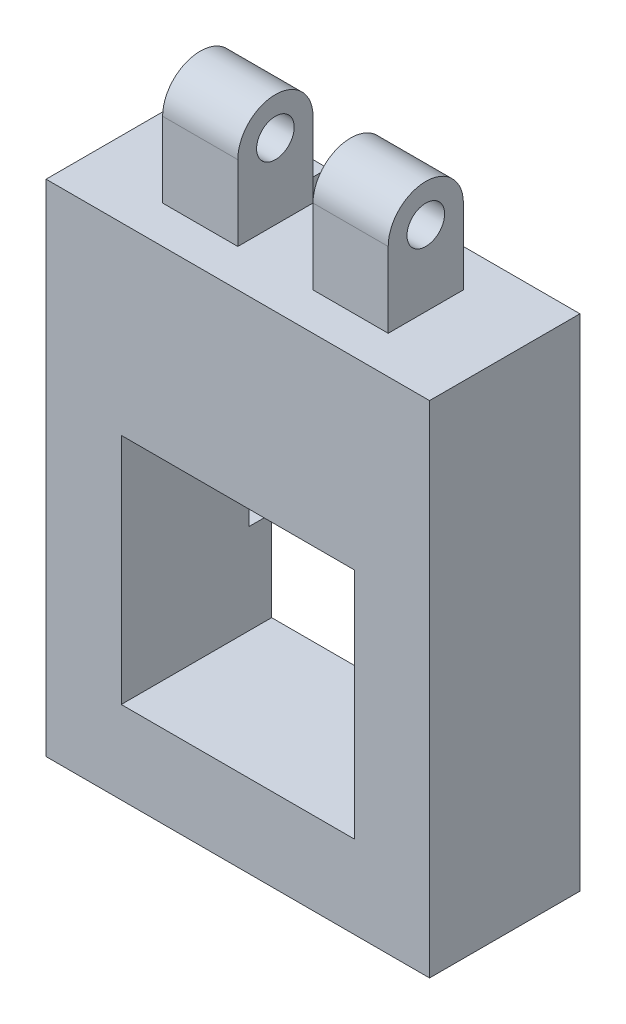
ISO-10303-21;
HEADER;
FILE_DESCRIPTION(('STEP AP214'),'2;1');
FILE_NAME('part.step','',(''),(''),'','','');
FILE_SCHEMA(('AUTOMOTIVE_DESIGN { 1 0 10303 214 1 1 1 1 }'));
ENDSEC;
DATA;
#1=APPLICATION_CONTEXT('core data for automotive mechanical design processes');
#2=APPLICATION_PROTOCOL_DEFINITION('international standard','automotive_design',2000,#1);
#3=PRODUCT_CONTEXT('',#1,'mechanical');
#4=PRODUCT('Part','Part','',(#3));
#5=PRODUCT_RELATED_PRODUCT_CATEGORY('part','',(#4));
#6=PRODUCT_DEFINITION_FORMATION('','',#4);
#7=PRODUCT_DEFINITION_CONTEXT('part definition',#1,'design');
#8=PRODUCT_DEFINITION('design','',#6,#7);
#9=PRODUCT_DEFINITION_SHAPE('','',#8);
#10=(LENGTH_UNIT() NAMED_UNIT(*) SI_UNIT(.MILLI.,.METRE.));
#11=(NAMED_UNIT(*) PLANE_ANGLE_UNIT() SI_UNIT($,.RADIAN.));
#12=(NAMED_UNIT(*) SI_UNIT($,.STERADIAN.) SOLID_ANGLE_UNIT());
#13=UNCERTAINTY_MEASURE_WITH_UNIT(LENGTH_MEASURE(1.E-05),#10,'distance_accuracy_value','');
#14=(GEOMETRIC_REPRESENTATION_CONTEXT(3) GLOBAL_UNCERTAINTY_ASSIGNED_CONTEXT((#13)) GLOBAL_UNIT_ASSIGNED_CONTEXT((#10,
#11,#12)) REPRESENTATION_CONTEXT('',''));
#15=CARTESIAN_POINT('',(0.,0.,0.));
#16=DIRECTION('',(0.,0.,1.));
#17=DIRECTION('',(1.,0.,0.));
#18=AXIS2_PLACEMENT_3D('',#15,#16,#17);
#19=CARTESIAN_POINT('',(-51.4685029579254,477.398568848088,14.9557076845566));
#20=DIRECTION('',(0.,-1.,0.));
#21=DIRECTION('',(0.,0.,-1.));
#22=AXIS2_PLACEMENT_3D('',#19,#20,#21);
#23=PLANE('',#22);
#24=DIRECTION('',(1.,0.,0.));
#25=VECTOR('',#24,1.);
#26=CARTESIAN_POINT('',(-6.46850295793168,477.398568848088,9.95570768455656));
#27=LINE('',#26,#25);
#28=CARTESIAN_POINT('',(3.53149704208093,477.398568848088,9.95570768455656));
#29=VERTEX_POINT('',#28);
#30=CARTESIAN_POINT('',(13.5314970420809,477.398568848088,9.95570768455656));
#31=VERTEX_POINT('',#30);
#32=EDGE_CURVE('E480',#29,#31,#27,.T.);
#33=ORIENTED_EDGE('',*,*,#32,.F.);
#34=DIRECTION('',(-1.26114396703514E-12,0.,-1.));
#35=VECTOR('',#34,1.);
#36=CARTESIAN_POINT('',(3.53149704206832,477.398568848088,-0.0442923154434357));
#37=LINE('',#36,#35);
#38=CARTESIAN_POINT('',(3.53149704206832,477.398568848088,-0.0442923154434357));
#39=VERTEX_POINT('',#38);
#40=EDGE_CURVE('E440',#29,#39,#37,.T.);
#41=ORIENTED_EDGE('',*,*,#40,.T.);
#42=DIRECTION('',(-1.,0.,0.));
#43=VECTOR('',#42,1.);
#44=CARTESIAN_POINT('',(-6.46850295793168,477.398568848088,-0.0442923154434357));
#45=LINE('',#44,#43);
#46=CARTESIAN_POINT('',(13.5314970420809,477.398568848088,-0.0442923154434366));
#47=VERTEX_POINT('',#46);
#48=EDGE_CURVE('E486',#47,#39,#45,.T.);
#49=ORIENTED_EDGE('',*,*,#48,.F.);
#50=DIRECTION('',(0.,0.,-1.));
#51=VECTOR('',#50,1.);
#52=CARTESIAN_POINT('',(13.5314970420809,477.398568848088,9.95570768455656));
#53=LINE('',#52,#51);
#54=EDGE_CURVE('E449',#31,#47,#53,.T.);
#55=ORIENTED_EDGE('',*,*,#54,.F.);
#56=EDGE_LOOP('',(#33,#41,#49,#55));
#57=FACE_BOUND('',#56,.T.);
#58=DIRECTION('',(0.,0.,1.));
#59=VECTOR('',#58,1.);
#60=CARTESIAN_POINT('',(-6.46850295793168,477.398568848088,-0.0442923154434357));
#61=LINE('',#60,#59);
#62=CARTESIAN_POINT('',(-6.46850295793168,477.398568848088,-0.0442923154434357));
#63=VERTEX_POINT('',#62);
#64=CARTESIAN_POINT('',(-6.46850295793168,477.398568848088,9.95570768455656));
#65=VERTEX_POINT('',#64);
#66=EDGE_CURVE('E436',#63,#65,#61,.T.);
#67=ORIENTED_EDGE('',*,*,#66,.T.);
#68=CARTESIAN_POINT('',(-16.4685029579317,477.398568848088,9.95570768455656));
#69=VERTEX_POINT('',#68);
#70=EDGE_CURVE('E481',#69,#65,#27,.T.);
#71=ORIENTED_EDGE('',*,*,#70,.F.);
#72=DIRECTION('',(0.,0.,1.));
#73=VECTOR('',#72,1.);
#74=CARTESIAN_POINT('',(-16.4685029579317,477.398568848088,9.95570768455656));
#75=LINE('',#74,#73);
#76=CARTESIAN_POINT('',(-16.4685029579317,477.398568848088,-0.0442923154434357));
#77=VERTEX_POINT('',#76);
#78=EDGE_CURVE('E470',#77,#69,#75,.T.);
#79=ORIENTED_EDGE('',*,*,#78,.F.);
#80=EDGE_CURVE('E485',#63,#77,#45,.T.);
#81=ORIENTED_EDGE('',*,*,#80,.F.);
#82=EDGE_LOOP('',(#67,#71,#79,#81));
#83=FACE_BOUND('',#82,.T.);
#84=DIRECTION('',(-1.,0.,0.));
#85=VECTOR('',#84,1.);
#86=CARTESIAN_POINT('',(-51.4685029579254,477.398568848088,-5.04429231544344));
#87=LINE('',#86,#85);
#88=CARTESIAN_POINT('',(-9.46850295792537,477.398568848088,-5.04429231544344));
#89=VERTEX_POINT('',#88);
#90=CARTESIAN_POINT('',(-26.9685029579254,477.398568848088,-5.04429231544344));
#91=VERTEX_POINT('',#90);
#92=EDGE_CURVE('E490',#89,#91,#87,.T.);
#93=ORIENTED_EDGE('',*,*,#92,.T.);
#94=DIRECTION('',(0.,0.,1.));
#95=VECTOR('',#94,1.);
#96=CARTESIAN_POINT('',(-26.9685029579254,477.398568848088,14.9557076845566));
#97=LINE('',#96,#95);
#98=CARTESIAN_POINT('',(-26.9685029579254,477.398568848088,14.9557076845566));
#99=VERTEX_POINT('',#98);
#100=EDGE_CURVE('E335',#91,#99,#97,.T.);
#101=ORIENTED_EDGE('',*,*,#100,.T.);
#102=DIRECTION('',(-1.,0.,0.));
#103=VECTOR('',#102,1.);
#104=CARTESIAN_POINT('',(-51.4685029579254,477.398568848088,14.9557076845566));
#105=LINE('',#104,#103);
#106=CARTESIAN_POINT('',(24.0314970420746,477.398568848088,14.9557076845566));
#107=VERTEX_POINT('',#106);
#108=EDGE_CURVE('E491',#107,#99,#105,.T.);
#109=ORIENTED_EDGE('',*,*,#108,.F.);
#110=DIRECTION('',(0.,0.,1.));
#111=VECTOR('',#110,1.);
#112=CARTESIAN_POINT('',(24.0314970420746,477.398568848088,14.9557076845566));
#113=LINE('',#112,#111);
#114=CARTESIAN_POINT('',(24.0314970420746,477.398568848088,-5.04429231544344));
#115=VERTEX_POINT('',#114);
#116=EDGE_CURVE('E330',#115,#107,#113,.T.);
#117=ORIENTED_EDGE('',*,*,#116,.F.);
#118=CARTESIAN_POINT('',(6.53149704207463,477.398568848088,-5.04429231544344));
#119=VERTEX_POINT('',#118);
#120=EDGE_CURVE('E496',#115,#119,#87,.T.);
#121=ORIENTED_EDGE('',*,*,#120,.T.);
#122=DIRECTION('',(0.,0.,-1.));
#123=VECTOR('',#122,1.);
#124=CARTESIAN_POINT('',(6.53149704207463,477.398568848088,-1.04429231544344));
#125=LINE('',#124,#123);
#126=CARTESIAN_POINT('',(6.53149704207463,477.398568848088,-1.04429231544344));
#127=VERTEX_POINT('',#126);
#128=EDGE_CURVE('E367',#127,#119,#125,.T.);
#129=ORIENTED_EDGE('',*,*,#128,.F.);
#130=DIRECTION('',(1.,0.,0.));
#131=VECTOR('',#130,1.);
#132=CARTESIAN_POINT('',(1.46850295792533,477.398568848088,-1.04429231544344));
#133=LINE('',#132,#131);
#134=CARTESIAN_POINT('',(-9.46850295792537,477.398568848088,-1.04429231544344));
#135=VERTEX_POINT('',#134);
#136=EDGE_CURVE('E349',#135,#127,#133,.T.);
#137=ORIENTED_EDGE('',*,*,#136,.F.);
#138=DIRECTION('',(0.,0.,-1.));
#139=VECTOR('',#138,1.);
#140=CARTESIAN_POINT('',(-9.46850295792537,477.398568848088,-1.04429231544344));
#141=LINE('',#140,#139);
#142=EDGE_CURVE('E371',#135,#89,#141,.T.);
#143=ORIENTED_EDGE('',*,*,#142,.T.);
#144=EDGE_LOOP('',(#93,#101,#109,#117,#121,#129,#137,#143));
#145=FACE_BOUND('',#144,.T.);
#146=ADVANCED_FACE('F64',(#57,#83,#145),#23,.F.);
#147=CARTESIAN_POINT('',(1.46850295792533,-437.877293220878,-5.04429231544344));
#148=DIRECTION('',(0.,0.,1.));
#149=DIRECTION('',(1.,0.,0.));
#150=AXIS2_PLACEMENT_3D('',#147,#148,#149);
#151=PLANE('',#150);
#152=DIRECTION('',(0.,1.,0.));
#153=VECTOR('',#152,1.);
#154=CARTESIAN_POINT('',(14.0314970420747,-437.877293220878,-5.04429231544344));
#155=LINE('',#154,#153);
#156=CARTESIAN_POINT('',(14.0314970420746,421.898568848089,-5.04429231544344));
#157=VERTEX_POINT('',#156);
#158=CARTESIAN_POINT('',(14.0314970420746,433.898568848089,-5.04429231544344));
#159=VERTEX_POINT('',#158);
#160=EDGE_CURVE('E509',#157,#159,#155,.T.);
#161=ORIENTED_EDGE('',*,*,#160,.T.);
#162=DIRECTION('',(-1.,0.,0.));
#163=VECTOR('',#162,1.);
#164=CARTESIAN_POINT('',(-23.4685029579254,433.898568848089,-5.04429231544344));
#165=LINE('',#164,#163);
#166=CARTESIAN_POINT('',(20.5314970420746,433.898568848089,-5.04429231544344));
#167=VERTEX_POINT('',#166);
#168=EDGE_CURVE('E275',#167,#159,#165,.T.);
#169=ORIENTED_EDGE('',*,*,#168,.F.);
#170=DIRECTION('',(0.,-1.,0.));
#171=VECTOR('',#170,1.);
#172=CARTESIAN_POINT('',(20.5314970420746,433.898568848089,-5.04429231544344));
#173=LINE('',#172,#171);
#174=CARTESIAN_POINT('',(20.5314970420746,440.898568848089,-5.04429231544344));
#175=VERTEX_POINT('',#174);
#176=EDGE_CURVE('E292',#175,#167,#173,.T.);
#177=ORIENTED_EDGE('',*,*,#176,.F.);
#178=DIRECTION('',(1.,0.,0.));
#179=VECTOR('',#178,1.);
#180=CARTESIAN_POINT('',(-23.4685029579254,440.898568848089,-5.04429231544344));
#181=LINE('',#180,#179);
#182=CARTESIAN_POINT('',(14.0314970420746,440.898568848089,-5.04429231544344));
#183=VERTEX_POINT('',#182);
#184=EDGE_CURVE('E288',#183,#175,#181,.T.);
#185=ORIENTED_EDGE('',*,*,#184,.F.);
#186=CARTESIAN_POINT('',(14.0314970420746,452.898568848089,-5.04429231544344));
#187=VERTEX_POINT('',#186);
#188=EDGE_CURVE('E508',#183,#187,#155,.T.);
#189=ORIENTED_EDGE('',*,*,#188,.T.);
#190=DIRECTION('',(-1.,0.,0.));
#191=VECTOR('',#190,1.);
#192=CARTESIAN_POINT('',(1.46850295792533,452.898568848089,-5.04429231544344));
#193=LINE('',#192,#191);
#194=CARTESIAN_POINT('',(6.53149704207463,452.898568848089,-5.04429231544344));
#195=VERTEX_POINT('',#194);
#196=EDGE_CURVE('E514',#187,#195,#193,.T.);
#197=ORIENTED_EDGE('',*,*,#196,.T.);
#198=DIRECTION('',(0.,1.,0.));
#199=VECTOR('',#198,1.);
#200=CARTESIAN_POINT('',(6.5314970420746,-437.877293220878,-5.04429231544344));
#201=LINE('',#200,#199);
#202=EDGE_CURVE('E345',#195,#119,#201,.T.);
#203=ORIENTED_EDGE('',*,*,#202,.T.);
#204=ORIENTED_EDGE('',*,*,#120,.F.);
#205=DIRECTION('',(0.,-1.,0.));
#206=VECTOR('',#205,1.);
#207=CARTESIAN_POINT('',(24.0314970420746,0.,-5.04429231544344));
#208=LINE('',#207,#206);
#209=CARTESIAN_POINT('',(24.0314970420746,410.898568848089,-5.04429231544344));
#210=VERTEX_POINT('',#209);
#211=EDGE_CURVE('E322',#115,#210,#208,.T.);
#212=ORIENTED_EDGE('',*,*,#211,.T.);
#213=DIRECTION('',(1.,0.,0.));
#214=VECTOR('',#213,1.);
#215=CARTESIAN_POINT('',(0.,410.898568848089,-5.04429231544344));
#216=LINE('',#215,#214);
#217=CARTESIAN_POINT('',(-26.9685029579254,410.898568848089,-5.04429231544344));
#218=VERTEX_POINT('',#217);
#219=EDGE_CURVE('E318',#218,#210,#216,.T.);
#220=ORIENTED_EDGE('',*,*,#219,.F.);
#221=DIRECTION('',(0.,-1.,0.));
#222=VECTOR('',#221,1.);
#223=CARTESIAN_POINT('',(-26.9685029579254,0.,-5.04429231544344));
#224=LINE('',#223,#222);
#225=EDGE_CURVE('E314',#91,#218,#224,.T.);
#226=ORIENTED_EDGE('',*,*,#225,.F.);
#227=ORIENTED_EDGE('',*,*,#92,.F.);
#228=DIRECTION('',(0.,1.,0.));
#229=VECTOR('',#228,1.);
#230=CARTESIAN_POINT('',(-9.46850295792537,-437.877293220878,-5.04429231544344));
#231=LINE('',#230,#229);
#232=CARTESIAN_POINT('',(-9.46850295792537,452.898568848089,-5.04429231544344));
#233=VERTEX_POINT('',#232);
#234=EDGE_CURVE('E339',#233,#89,#231,.T.);
#235=ORIENTED_EDGE('',*,*,#234,.F.);
#236=CARTESIAN_POINT('',(-16.9685029579254,452.898568848089,-5.04429231544344));
#237=VERTEX_POINT('',#236);
#238=EDGE_CURVE('E513',#233,#237,#193,.T.);
#239=ORIENTED_EDGE('',*,*,#238,.T.);
#240=DIRECTION('',(0.,-1.,0.));
#241=VECTOR('',#240,1.);
#242=CARTESIAN_POINT('',(-16.9685029579254,-437.877293220878,-5.04429231544344));
#243=LINE('',#242,#241);
#244=CARTESIAN_POINT('',(-16.9685029579254,440.898568848089,-5.04429231544344));
#245=VERTEX_POINT('',#244);
#246=EDGE_CURVE('E519',#237,#245,#243,.T.);
#247=ORIENTED_EDGE('',*,*,#246,.T.);
#248=CARTESIAN_POINT('',(-23.4685029579254,440.898568848089,-5.04429231544344));
#249=VERTEX_POINT('',#248);
#250=EDGE_CURVE('E289',#249,#245,#181,.T.);
#251=ORIENTED_EDGE('',*,*,#250,.F.);
#252=DIRECTION('',(0.,1.,0.));
#253=VECTOR('',#252,1.);
#254=CARTESIAN_POINT('',(-23.4685029579254,433.898568848089,-5.04429231544344));
#255=LINE('',#254,#253);
#256=CARTESIAN_POINT('',(-23.4685029579254,433.898568848089,-5.04429231544344));
#257=VERTEX_POINT('',#256);
#258=EDGE_CURVE('E256',#257,#249,#255,.T.);
#259=ORIENTED_EDGE('',*,*,#258,.F.);
#260=CARTESIAN_POINT('',(-16.9685029579254,433.898568848089,-5.04429231544344));
#261=VERTEX_POINT('',#260);
#262=EDGE_CURVE('E279',#261,#257,#165,.T.);
#263=ORIENTED_EDGE('',*,*,#262,.F.);
#264=CARTESIAN_POINT('',(-16.9685029579254,421.898568848089,-5.04429231544344));
#265=VERTEX_POINT('',#264);
#266=EDGE_CURVE('E518',#261,#265,#243,.T.);
#267=ORIENTED_EDGE('',*,*,#266,.T.);
#268=DIRECTION('',(1.,0.,0.));
#269=VECTOR('',#268,1.);
#270=CARTESIAN_POINT('',(1.46850295792225,421.898568848089,-5.04429231544344));
#271=LINE('',#270,#269);
#272=EDGE_CURVE('E504',#265,#157,#271,.T.);
#273=ORIENTED_EDGE('',*,*,#272,.T.);
#274=EDGE_LOOP('',(#161,#169,#177,#185,#189,#197,#203,#204,#212,#220,#226,#227,#235,#239,#247,
#251,#259,#263,#267,#273));
#275=FACE_BOUND('',#274,.T.);
#276=ADVANCED_FACE('F549',(#275),#151,.F.);
#277=CARTESIAN_POINT('',(-16.9685029579254,452.898568848089,-45.0442923154434));
#278=DIRECTION('',(0.,1.,0.));
#279=DIRECTION('',(0.,0.,1.));
#280=AXIS2_PLACEMENT_3D('',#277,#278,#279);
#281=PLANE('',#280);
#282=DIRECTION('',(0.,0.,-1.));
#283=VECTOR('',#282,1.);
#284=CARTESIAN_POINT('',(6.53149704207463,452.898568848089,-1.04429231544344));
#285=LINE('',#284,#283);
#286=CARTESIAN_POINT('',(6.53149704207463,452.898568848089,-1.04429231544343));
#287=VERTEX_POINT('',#286);
#288=EDGE_CURVE('E362',#287,#195,#285,.T.);
#289=ORIENTED_EDGE('',*,*,#288,.T.);
#290=ORIENTED_EDGE('',*,*,#196,.F.);
#291=DIRECTION('',(0.,0.,1.));
#292=VECTOR('',#291,1.);
#293=CARTESIAN_POINT('',(14.0314970420746,452.898568848089,-45.0442923154434));
#294=LINE('',#293,#292);
#295=CARTESIAN_POINT('',(14.0314970420746,452.898568848089,14.9557076845566));
#296=VERTEX_POINT('',#295);
#297=EDGE_CURVE('E396',#187,#296,#294,.T.);
#298=ORIENTED_EDGE('',*,*,#297,.T.);
#299=DIRECTION('',(-1.,0.,0.));
#300=VECTOR('',#299,1.);
#301=CARTESIAN_POINT('',(-16.9685029579254,452.898568848089,14.9557076845566));
#302=LINE('',#301,#300);
#303=CARTESIAN_POINT('',(-16.9685029579254,452.898568848089,14.9557076845566));
#304=VERTEX_POINT('',#303);
#305=EDGE_CURVE('E387',#296,#304,#302,.T.);
#306=ORIENTED_EDGE('',*,*,#305,.T.);
#307=DIRECTION('',(0.,0.,1.));
#308=VECTOR('',#307,1.);
#309=CARTESIAN_POINT('',(-16.9685029579254,452.898568848089,-45.0442923154434));
#310=LINE('',#309,#308);
#311=EDGE_CURVE('E392',#237,#304,#310,.T.);
#312=ORIENTED_EDGE('',*,*,#311,.F.);
#313=ORIENTED_EDGE('',*,*,#238,.F.);
#314=DIRECTION('',(0.,0.,-1.));
#315=VECTOR('',#314,1.);
#316=CARTESIAN_POINT('',(-9.46850295792537,452.898568848089,-1.04429231544344));
#317=LINE('',#316,#315);
#318=CARTESIAN_POINT('',(-9.46850295792537,452.898568848089,-1.04429231544344));
#319=VERTEX_POINT('',#318);
#320=EDGE_CURVE('E356',#319,#233,#317,.T.);
#321=ORIENTED_EDGE('',*,*,#320,.F.);
#322=DIRECTION('',(-1.,0.,0.));
#323=VECTOR('',#322,1.);
#324=CARTESIAN_POINT('',(1.46850295792533,452.898568848089,-1.04429231544344));
#325=LINE('',#324,#323);
#326=EDGE_CURVE('E340',#287,#319,#325,.T.);
#327=ORIENTED_EDGE('',*,*,#326,.F.);
#328=EDGE_LOOP('',(#289,#290,#298,#306,#312,#313,#321,#327));
#329=FACE_BOUND('',#328,.T.);
#330=ADVANCED_FACE('F612',(#329),#281,.F.);
#331=CARTESIAN_POINT('',(-6.46850295793168,497.398568848088,9.95570768455656));
#332=DIRECTION('',(0.,0.,-1.));
#333=DIRECTION('',(-1.,0.,0.));
#334=AXIS2_PLACEMENT_3D('',#331,#332,#333);
#335=PLANE('',#334);
#336=DIRECTION('',(1.,0.,0.));
#337=VECTOR('',#336,1.);
#338=CARTESIAN_POINT('',(-26.4685029579191,487.398568848088,9.95570768455656));
#339=LINE('',#338,#337);
#340=CARTESIAN_POINT('',(-16.4685029579317,487.398568848088,9.95570768455656));
#341=VERTEX_POINT('',#340);
#342=CARTESIAN_POINT('',(-6.46850295793168,487.398568848088,9.95570768455656));
#343=VERTEX_POINT('',#342);
#344=EDGE_CURVE('E412',#341,#343,#339,.T.);
#345=ORIENTED_EDGE('',*,*,#344,.F.);
#346=DIRECTION('',(0.,-1.,0.));
#347=VECTOR('',#346,1.);
#348=CARTESIAN_POINT('',(-16.4685029579317,497.398568848088,9.95570768455656));
#349=LINE('',#348,#347);
#350=EDGE_CURVE('E477',#341,#69,#349,.T.);
#351=ORIENTED_EDGE('',*,*,#350,.T.);
#352=ORIENTED_EDGE('',*,*,#70,.T.);
#353=DIRECTION('',(0.,1.,0.));
#354=VECTOR('',#353,1.);
#355=CARTESIAN_POINT('',(-6.46850295793168,477.398568848088,9.95570768455656));
#356=LINE('',#355,#354);
#357=EDGE_CURVE('E444',#65,#343,#356,.T.);
#358=ORIENTED_EDGE('',*,*,#357,.T.);
#359=EDGE_LOOP('',(#345,#351,#352,#358));
#360=FACE_BOUND('',#359,.T.);
#361=ADVANCED_FACE('F658',(#360),#335,.F.);
#362=CARTESIAN_POINT('',(3.53149704208093,487.398568848088,9.95570768455656));
#363=VERTEX_POINT('',#362);
#364=CARTESIAN_POINT('',(13.5314970420809,487.398568848088,9.95570768455656));
#365=VERTEX_POINT('',#364);
#366=EDGE_CURVE('E409',#363,#365,#339,.T.);
#367=ORIENTED_EDGE('',*,*,#366,.F.);
#368=DIRECTION('',(0.,1.,0.));
#369=VECTOR('',#368,1.);
#370=CARTESIAN_POINT('',(3.53149704208093,477.398568848088,9.95570768455656));
#371=LINE('',#370,#369);
#372=EDGE_CURVE('E454',#29,#363,#371,.T.);
#373=ORIENTED_EDGE('',*,*,#372,.F.);
#374=ORIENTED_EDGE('',*,*,#32,.T.);
#375=DIRECTION('',(0.,-1.,0.));
#376=VECTOR('',#375,1.);
#377=CARTESIAN_POINT('',(13.5314970420809,497.398568848088,9.95570768455656));
#378=LINE('',#377,#376);
#379=EDGE_CURVE('E464',#365,#31,#378,.T.);
#380=ORIENTED_EDGE('',*,*,#379,.F.);
#381=EDGE_LOOP('',(#367,#373,#374,#380));
#382=FACE_BOUND('',#381,.T.);
#383=ADVANCED_FACE('F692',(#382),#335,.F.);
#384=CARTESIAN_POINT('',(-16.4685029579317,497.398568848088,9.95570768455656));
#385=DIRECTION('',(1.,0.,0.));
#386=DIRECTION('',(0.,0.,-1.));
#387=AXIS2_PLACEMENT_3D('',#384,#385,#386);
#388=PLANE('',#387);
#389=CARTESIAN_POINT('',(-16.4685029579317,487.398568848088,4.95570768455656));
#390=DIRECTION('',(-1.,0.,0.));
#391=DIRECTION('',(0.,0.,1.));
#392=AXIS2_PLACEMENT_3D('',#389,#390,#391);
#393=CIRCLE('',#392,2.5);
#394=CARTESIAN_POINT('',(-16.4685029579317,487.398568848088,7.45570768455656));
#395=VERTEX_POINT('',#394);
#396=EDGE_CURVE('E423',#395,#395,#393,.T.);
#397=ORIENTED_EDGE('',*,*,#396,.F.);
#398=EDGE_LOOP('',(#397));
#399=FACE_BOUND('',#398,.T.);
#400=CARTESIAN_POINT('',(-16.4685029579317,487.398568848088,4.95570768455656));
#401=DIRECTION('',(1.,0.,0.));
#402=DIRECTION('',(0.,0.,-1.));
#403=AXIS2_PLACEMENT_3D('',#400,#401,#402);
#404=CIRCLE('',#403,5.);
#405=CARTESIAN_POINT('',(-16.4685029579317,487.398568848088,-0.0442923154434366));
#406=VERTEX_POINT('',#405);
#407=EDGE_CURVE('E420',#406,#341,#404,.T.);
#408=ORIENTED_EDGE('',*,*,#407,.F.);
#409=DIRECTION('',(0.,-1.,0.));
#410=VECTOR('',#409,1.);
#411=CARTESIAN_POINT('',(-16.4685029579317,497.398568848088,-0.0442923154434357));
#412=LINE('',#411,#410);
#413=EDGE_CURVE('E474',#406,#77,#412,.T.);
#414=ORIENTED_EDGE('',*,*,#413,.T.);
#415=ORIENTED_EDGE('',*,*,#78,.T.);
#416=ORIENTED_EDGE('',*,*,#350,.F.);
#417=EDGE_LOOP('',(#408,#414,#415,#416));
#418=FACE_BOUND('',#417,.T.);
#419=ADVANCED_FACE('F685',(#399,#418),#388,.F.);
#420=CARTESIAN_POINT('',(13.5314970420809,497.398568848088,9.95570768455656));
#421=DIRECTION('',(-1.,0.,0.));
#422=DIRECTION('',(0.,0.,1.));
#423=AXIS2_PLACEMENT_3D('',#420,#421,#422);
#424=PLANE('',#423);
#425=CARTESIAN_POINT('',(13.5314970420809,487.398568848088,4.95570768455656));
#426=DIRECTION('',(-1.,0.,0.));
#427=DIRECTION('',(0.,0.,1.));
#428=AXIS2_PLACEMENT_3D('',#425,#426,#427);
#429=CIRCLE('',#428,2.5);
#430=CARTESIAN_POINT('',(13.5314970420809,487.398568848088,7.45570768455656));
#431=VERTEX_POINT('',#430);
#432=EDGE_CURVE('E432',#431,#431,#429,.T.);
#433=ORIENTED_EDGE('',*,*,#432,.T.);
#434=EDGE_LOOP('',(#433));
#435=FACE_BOUND('',#434,.T.);
#436=CARTESIAN_POINT('',(13.5314970420809,487.398568848088,4.95570768455656));
#437=DIRECTION('',(1.,0.,0.));
#438=DIRECTION('',(0.,0.,-1.));
#439=AXIS2_PLACEMENT_3D('',#436,#437,#438);
#440=CIRCLE('',#439,5.);
#441=CARTESIAN_POINT('',(13.5314970420809,487.398568848088,-0.0442923154434366));
#442=VERTEX_POINT('',#441);
#443=EDGE_CURVE('E395',#442,#365,#440,.T.);
#444=ORIENTED_EDGE('',*,*,#443,.T.);
#445=ORIENTED_EDGE('',*,*,#379,.T.);
#446=ORIENTED_EDGE('',*,*,#54,.T.);
#447=DIRECTION('',(0.,-1.,0.));
#448=VECTOR('',#447,1.);
#449=CARTESIAN_POINT('',(13.5314970420809,497.398568848088,-0.0442923154434366));
#450=LINE('',#449,#448);
#451=EDGE_CURVE('E467',#442,#47,#450,.T.);
#452=ORIENTED_EDGE('',*,*,#451,.F.);
#453=EDGE_LOOP('',(#444,#445,#446,#452));
#454=FACE_BOUND('',#453,.T.);
#455=ADVANCED_FACE('F682',(#435,#454),#424,.F.);
#456=CARTESIAN_POINT('',(-6.46850295793168,497.398568848088,9.95570768455656));
#457=DIRECTION('',(-1.,0.,0.));
#458=DIRECTION('',(0.,0.,1.));
#459=AXIS2_PLACEMENT_3D('',#456,#457,#458);
#460=PLANE('',#459);
#461=CARTESIAN_POINT('',(-6.46850295793168,487.398568848088,4.95570768455656));
#462=DIRECTION('',(-1.,0.,0.));
#463=DIRECTION('',(0.,0.,1.));
#464=AXIS2_PLACEMENT_3D('',#461,#462,#463);
#465=CIRCLE('',#464,2.5);
#466=CARTESIAN_POINT('',(-6.46850295793168,487.398568848088,7.45570768455656));
#467=VERTEX_POINT('',#466);
#468=EDGE_CURVE('E428',#467,#467,#465,.T.);
#469=ORIENTED_EDGE('',*,*,#468,.T.);
#470=EDGE_LOOP('',(#469));
#471=FACE_BOUND('',#470,.T.);
#472=CARTESIAN_POINT('',(-6.46850295793168,487.398568848088,4.95570768455656));
#473=DIRECTION('',(-1.,0.,0.));
#474=DIRECTION('',(0.,0.,1.));
#475=AXIS2_PLACEMENT_3D('',#472,#473,#474);
#476=CIRCLE('',#475,5.);
#477=CARTESIAN_POINT('',(-6.46850295793168,487.398568848088,-0.0442923154434366));
#478=VERTEX_POINT('',#477);
#479=EDGE_CURVE('E417',#343,#478,#476,.T.);
#480=ORIENTED_EDGE('',*,*,#479,.F.);
#481=ORIENTED_EDGE('',*,*,#357,.F.);
#482=ORIENTED_EDGE('',*,*,#66,.F.);
#483=DIRECTION('',(0.,1.,0.));
#484=VECTOR('',#483,1.);
#485=CARTESIAN_POINT('',(-6.46850295793168,477.398568848088,-0.0442923154434357));
#486=LINE('',#485,#484);
#487=EDGE_CURVE('E445',#63,#478,#486,.T.);
#488=ORIENTED_EDGE('',*,*,#487,.T.);
#489=EDGE_LOOP('',(#480,#481,#482,#488));
#490=FACE_BOUND('',#489,.T.);
#491=ADVANCED_FACE('F680',(#471,#490),#460,.F.);
#492=CARTESIAN_POINT('',(3.53149704208093,497.398568848088,9.95570768455656));
#493=DIRECTION('',(1.,0.,0.));
#494=DIRECTION('',(0.,0.,-1.));
#495=AXIS2_PLACEMENT_3D('',#492,#493,#494);
#496=PLANE('',#495);
#497=CARTESIAN_POINT('',(3.53149704208093,487.398568848088,4.95570768455656));
#498=DIRECTION('',(1.,0.,0.));
#499=DIRECTION('',(0.,0.,-1.));
#500=AXIS2_PLACEMENT_3D('',#497,#498,#499);
#501=CIRCLE('',#500,2.5);
#502=CARTESIAN_POINT('',(3.53149704208093,487.398568848088,2.45570768455656));
#503=VERTEX_POINT('',#502);
#504=EDGE_CURVE('E427',#503,#503,#501,.T.);
#505=ORIENTED_EDGE('',*,*,#504,.T.);
#506=EDGE_LOOP('',(#505));
#507=FACE_BOUND('',#506,.T.);
#508=CARTESIAN_POINT('',(3.53149704208093,487.398568848088,4.95570768455656));
#509=DIRECTION('',(1.,0.,0.));
#510=DIRECTION('',(0.,0.,-1.));
#511=AXIS2_PLACEMENT_3D('',#508,#509,#510);
#512=CIRCLE('',#511,5.);
#513=CARTESIAN_POINT('',(3.53149704206832,487.398568848088,-0.0442923154434357));
#514=VERTEX_POINT('',#513);
#515=EDGE_CURVE('E495',#514,#363,#512,.T.);
#516=ORIENTED_EDGE('',*,*,#515,.F.);
#517=DIRECTION('',(0.,1.,0.));
#518=VECTOR('',#517,1.);
#519=CARTESIAN_POINT('',(3.53149704206832,477.398568848088,-0.0442923154434357));
#520=LINE('',#519,#518);
#521=EDGE_CURVE('E450',#39,#514,#520,.T.);
#522=ORIENTED_EDGE('',*,*,#521,.F.);
#523=ORIENTED_EDGE('',*,*,#40,.F.);
#524=ORIENTED_EDGE('',*,*,#372,.T.);
#525=EDGE_LOOP('',(#516,#522,#523,#524));
#526=FACE_BOUND('',#525,.T.);
#527=ADVANCED_FACE('F676',(#507,#526),#496,.F.);
#528=CARTESIAN_POINT('',(-6.46850295793168,497.398568848088,-0.0442923154434357));
#529=DIRECTION('',(0.,0.,1.));
#530=DIRECTION('',(1.,0.,0.));
#531=AXIS2_PLACEMENT_3D('',#528,#529,#530);
#532=PLANE('',#531);
#533=ORIENTED_EDGE('',*,*,#413,.F.);
#534=DIRECTION('',(1.,0.,0.));
#535=VECTOR('',#534,1.);
#536=CARTESIAN_POINT('',(-26.4685029579191,487.398568848088,-0.0442923154434366));
#537=LINE('',#536,#535);
#538=EDGE_CURVE('E413',#406,#478,#537,.T.);
#539=ORIENTED_EDGE('',*,*,#538,.T.);
#540=ORIENTED_EDGE('',*,*,#487,.F.);
#541=ORIENTED_EDGE('',*,*,#80,.T.);
#542=EDGE_LOOP('',(#533,#539,#540,#541));
#543=FACE_BOUND('',#542,.T.);
#544=ADVANCED_FACE('F679',(#543),#532,.F.);
#545=CARTESIAN_POINT('',(1.46850295792533,-437.877293220878,14.9557076845566));
#546=DIRECTION('',(0.,0.,1.));
#547=DIRECTION('',(1.,0.,0.));
#548=AXIS2_PLACEMENT_3D('',#545,#546,#547);
#549=PLANE('',#548);
#550=DIRECTION('',(0.,1.,0.));
#551=VECTOR('',#550,1.);
#552=CARTESIAN_POINT('',(-26.9685029579254,-437.877293220878,14.9557076845566));
#553=LINE('',#552,#551);
#554=CARTESIAN_POINT('',(-26.9685029579254,410.898568848089,14.9557076845566));
#555=VERTEX_POINT('',#554);
#556=EDGE_CURVE('E530',#555,#99,#553,.T.);
#557=ORIENTED_EDGE('',*,*,#556,.F.);
#558=DIRECTION('',(-1.,0.,0.));
#559=VECTOR('',#558,1.);
#560=CARTESIAN_POINT('',(1.46850295792533,410.898568848089,14.9557076845566));
#561=LINE('',#560,#559);
#562=CARTESIAN_POINT('',(24.0314970420746,410.898568848089,14.9557076845566));
#563=VERTEX_POINT('',#562);
#564=EDGE_CURVE('E523',#563,#555,#561,.T.);
#565=ORIENTED_EDGE('',*,*,#564,.F.);
#566=DIRECTION('',(0.,1.,0.));
#567=VECTOR('',#566,1.);
#568=CARTESIAN_POINT('',(24.0314970420746,-437.877293220878,14.9557076845566));
#569=LINE('',#568,#567);
#570=EDGE_CURVE('E526',#563,#107,#569,.T.);
#571=ORIENTED_EDGE('',*,*,#570,.T.);
#572=ORIENTED_EDGE('',*,*,#108,.T.);
#573=EDGE_LOOP('',(#557,#565,#571,#572));
#574=FACE_BOUND('',#573,.T.);
#575=DIRECTION('',(0.,-1.,0.));
#576=VECTOR('',#575,1.);
#577=CARTESIAN_POINT('',(-16.9685029579254,452.898568848089,14.9557076845566));
#578=LINE('',#577,#576);
#579=CARTESIAN_POINT('',(-16.9685029579254,421.898568848089,14.9557076845566));
#580=VERTEX_POINT('',#579);
#581=EDGE_CURVE('E366',#304,#580,#578,.T.);
#582=ORIENTED_EDGE('',*,*,#581,.F.);
#583=ORIENTED_EDGE('',*,*,#305,.F.);
#584=DIRECTION('',(0.,1.,0.));
#585=VECTOR('',#584,1.);
#586=CARTESIAN_POINT('',(14.0314970420746,452.898568848089,14.9557076845566));
#587=LINE('',#586,#585);
#588=CARTESIAN_POINT('',(14.0314970420746,421.898568848089,14.9557076845566));
#589=VERTEX_POINT('',#588);
#590=EDGE_CURVE('E383',#589,#296,#587,.T.);
#591=ORIENTED_EDGE('',*,*,#590,.F.);
#592=DIRECTION('',(1.,0.,0.));
#593=VECTOR('',#592,1.);
#594=CARTESIAN_POINT('',(-16.9685029579254,421.898568848089,14.9557076845566));
#595=LINE('',#594,#593);
#596=EDGE_CURVE('E379',#580,#589,#595,.T.);
#597=ORIENTED_EDGE('',*,*,#596,.F.);
#598=EDGE_LOOP('',(#582,#583,#591,#597));
#599=FACE_BOUND('',#598,.T.);
#600=ADVANCED_FACE('F584',(#574,#599),#549,.T.);
#601=ORIENTED_EDGE('',*,*,#521,.T.);
#602=EDGE_CURVE('E408',#514,#442,#537,.T.);
#603=ORIENTED_EDGE('',*,*,#602,.T.);
#604=ORIENTED_EDGE('',*,*,#451,.T.);
#605=ORIENTED_EDGE('',*,*,#48,.T.);
#606=EDGE_LOOP('',(#601,#603,#604,#605));
#607=FACE_BOUND('',#606,.T.);
#608=ADVANCED_FACE('F674',(#607),#532,.F.);
#609=CARTESIAN_POINT('',(69.5314970420684,487.398568848088,4.95570768455656));
#610=DIRECTION('',(-1.,0.,0.));
#611=DIRECTION('',(0.,0.,1.));
#612=AXIS2_PLACEMENT_3D('',#609,#610,#611);
#613=CYLINDRICAL_SURFACE('',#612,2.5);
#614=ORIENTED_EDGE('',*,*,#504,.F.);
#615=EDGE_LOOP('',(#614));
#616=FACE_BOUND('',#615,.T.);
#617=ORIENTED_EDGE('',*,*,#432,.F.);
#618=EDGE_LOOP('',(#617));
#619=FACE_BOUND('',#618,.T.);
#620=ADVANCED_FACE('F670',(#616,#619),#613,.F.);
#621=ORIENTED_EDGE('',*,*,#396,.T.);
#622=EDGE_LOOP('',(#621));
#623=FACE_BOUND('',#622,.T.);
#624=ORIENTED_EDGE('',*,*,#468,.F.);
#625=EDGE_LOOP('',(#624));
#626=FACE_BOUND('',#625,.T.);
#627=ADVANCED_FACE('F673',(#623,#626),#613,.F.);
#628=CARTESIAN_POINT('',(-26.4685029579191,487.398568848088,4.95570768455656));
#629=DIRECTION('',(1.,0.,0.));
#630=DIRECTION('',(0.,0.,-1.));
#631=AXIS2_PLACEMENT_3D('',#628,#629,#630);
#632=CYLINDRICAL_SURFACE('',#631,5.);
#633=ORIENTED_EDGE('',*,*,#515,.T.);
#634=ORIENTED_EDGE('',*,*,#366,.T.);
#635=ORIENTED_EDGE('',*,*,#443,.F.);
#636=ORIENTED_EDGE('',*,*,#602,.F.);
#637=EDGE_LOOP('',(#633,#634,#635,#636));
#638=FACE_BOUND('',#637,.T.);
#639=ADVANCED_FACE('F668',(#638),#632,.T.);
#640=ORIENTED_EDGE('',*,*,#407,.T.);
#641=ORIENTED_EDGE('',*,*,#344,.T.);
#642=ORIENTED_EDGE('',*,*,#479,.T.);
#643=ORIENTED_EDGE('',*,*,#538,.F.);
#644=EDGE_LOOP('',(#640,#641,#642,#643));
#645=FACE_BOUND('',#644,.T.);
#646=ADVANCED_FACE('F665',(#645),#632,.T.);
#647=CARTESIAN_POINT('',(-16.9685029579254,452.898568848089,-45.0442923154434));
#648=DIRECTION('',(-1.,0.,0.));
#649=DIRECTION('',(0.,0.,1.));
#650=AXIS2_PLACEMENT_3D('',#647,#648,#649);
#651=PLANE('',#650);
#652=ORIENTED_EDGE('',*,*,#266,.F.);
#653=DIRECTION('',(0.,0.,1.));
#654=VECTOR('',#653,1.);
#655=CARTESIAN_POINT('',(-16.9685029579254,433.898568848089,-45.0442923154434));
#656=LINE('',#655,#654);
#657=CARTESIAN_POINT('',(-16.9685029579254,433.898568848089,-2.04429231544344));
#658=VERTEX_POINT('',#657);
#659=EDGE_CURVE('E310',#261,#658,#656,.T.);
#660=ORIENTED_EDGE('',*,*,#659,.T.);
#661=DIRECTION('',(0.,-1.,0.));
#662=VECTOR('',#661,1.);
#663=CARTESIAN_POINT('',(-16.9685029579254,452.898568848089,-2.04429231544344));
#664=LINE('',#663,#662);
#665=CARTESIAN_POINT('',(-16.9685029579254,440.898568848089,-2.04429231544344));
#666=VERTEX_POINT('',#665);
#667=EDGE_CURVE('E299',#666,#658,#664,.T.);
#668=ORIENTED_EDGE('',*,*,#667,.F.);
#669=DIRECTION('',(0.,0.,-1.));
#670=VECTOR('',#669,1.);
#671=CARTESIAN_POINT('',(-16.9685029579254,440.898568848089,-45.0442923154434));
#672=LINE('',#671,#670);
#673=EDGE_CURVE('E264',#666,#245,#672,.T.);
#674=ORIENTED_EDGE('',*,*,#673,.T.);
#675=ORIENTED_EDGE('',*,*,#246,.F.);
#676=ORIENTED_EDGE('',*,*,#311,.T.);
#677=ORIENTED_EDGE('',*,*,#581,.T.);
#678=DIRECTION('',(0.,0.,1.));
#679=VECTOR('',#678,1.);
#680=CARTESIAN_POINT('',(-16.9685029579254,421.898568848089,-45.0442923154434));
#681=LINE('',#680,#679);
#682=EDGE_CURVE('E391',#265,#580,#681,.T.);
#683=ORIENTED_EDGE('',*,*,#682,.F.);
#684=EDGE_LOOP('',(#652,#660,#668,#674,#675,#676,#677,#683));
#685=FACE_BOUND('',#684,.T.);
#686=ADVANCED_FACE('F560',(#685),#651,.F.);
#687=CARTESIAN_POINT('',(14.0314970420746,452.898568848089,-45.0442923154434));
#688=DIRECTION('',(1.,0.,0.));
#689=DIRECTION('',(0.,1.,0.));
#690=AXIS2_PLACEMENT_3D('',#687,#688,#689);
#691=PLANE('',#690);
#692=DIRECTION('',(0.,1.,0.));
#693=VECTOR('',#692,1.);
#694=CARTESIAN_POINT('',(14.0314970420746,452.898568848089,-2.04429231544344));
#695=LINE('',#694,#693);
#696=CARTESIAN_POINT('',(14.0314970420746,433.898568848089,-2.04429231544344));
#697=VERTEX_POINT('',#696);
#698=CARTESIAN_POINT('',(14.0314970420746,440.898568848089,-2.04429231544344));
#699=VERTEX_POINT('',#698);
#700=EDGE_CURVE('E533',#697,#699,#695,.T.);
#701=ORIENTED_EDGE('',*,*,#700,.F.);
#702=DIRECTION('',(0.,0.,-1.));
#703=VECTOR('',#702,1.);
#704=CARTESIAN_POINT('',(14.0314970420746,433.898568848089,-45.0442923154434));
#705=LINE('',#704,#703);
#706=EDGE_CURVE('E12',#697,#159,#705,.T.);
#707=ORIENTED_EDGE('',*,*,#706,.T.);
#708=ORIENTED_EDGE('',*,*,#160,.F.);
#709=DIRECTION('',(0.,0.,1.));
#710=VECTOR('',#709,1.);
#711=CARTESIAN_POINT('',(14.0314970420746,421.898568848089,-45.0442923154434));
#712=LINE('',#711,#710);
#713=EDGE_CURVE('E399',#157,#589,#712,.T.);
#714=ORIENTED_EDGE('',*,*,#713,.T.);
#715=ORIENTED_EDGE('',*,*,#590,.T.);
#716=ORIENTED_EDGE('',*,*,#297,.F.);
#717=ORIENTED_EDGE('',*,*,#188,.F.);
#718=DIRECTION('',(0.,0.,1.));
#719=VECTOR('',#718,1.);
#720=CARTESIAN_POINT('',(14.0314970420746,440.898568848089,-45.0442923154434));
#721=LINE('',#720,#719);
#722=EDGE_CURVE('E72',#183,#699,#721,.T.);
#723=ORIENTED_EDGE('',*,*,#722,.T.);
#724=EDGE_LOOP('',(#701,#707,#708,#714,#715,#716,#717,#723));
#725=FACE_BOUND('',#724,.T.);
#726=ADVANCED_FACE('F540',(#725),#691,.F.);
#727=CARTESIAN_POINT('',(-16.9685029579254,421.898568848089,-45.0442923154434));
#728=DIRECTION('',(0.,-1.,0.));
#729=DIRECTION('',(1.,0.,0.));
#730=AXIS2_PLACEMENT_3D('',#727,#728,#729);
#731=PLANE('',#730);
#732=ORIENTED_EDGE('',*,*,#682,.T.);
#733=ORIENTED_EDGE('',*,*,#596,.T.);
#734=ORIENTED_EDGE('',*,*,#713,.F.);
#735=ORIENTED_EDGE('',*,*,#272,.F.);
#736=EDGE_LOOP('',(#732,#733,#734,#735));
#737=FACE_BOUND('',#736,.T.);
#738=ADVANCED_FACE('F578',(#737),#731,.F.);
#739=CARTESIAN_POINT('',(6.5314970420746,-437.877293220878,-1.04429231544344));
#740=DIRECTION('',(-1.,0.,0.));
#741=DIRECTION('',(0.,-1.,0.));
#742=AXIS2_PLACEMENT_3D('',#739,#740,#741);
#743=PLANE('',#742);
#744=ORIENTED_EDGE('',*,*,#202,.F.);
#745=ORIENTED_EDGE('',*,*,#288,.F.);
#746=DIRECTION('',(0.,1.,0.));
#747=VECTOR('',#746,1.);
#748=CARTESIAN_POINT('',(6.5314970420746,-437.877293220878,-1.04429231544344));
#749=LINE('',#748,#747);
#750=EDGE_CURVE('E353',#287,#127,#749,.T.);
#751=ORIENTED_EDGE('',*,*,#750,.T.);
#752=ORIENTED_EDGE('',*,*,#128,.T.);
#753=EDGE_LOOP('',(#744,#745,#751,#752));
#754=FACE_BOUND('',#753,.T.);
#755=ADVANCED_FACE('F639',(#754),#743,.T.);
#756=CARTESIAN_POINT('',(-9.46850295792537,-437.877293220878,-1.04429231544344));
#757=DIRECTION('',(-1.,0.,0.));
#758=DIRECTION('',(0.,0.,1.));
#759=AXIS2_PLACEMENT_3D('',#756,#757,#758);
#760=PLANE('',#759);
#761=ORIENTED_EDGE('',*,*,#234,.T.);
#762=ORIENTED_EDGE('',*,*,#142,.F.);
#763=DIRECTION('',(0.,1.,0.));
#764=VECTOR('',#763,1.);
#765=CARTESIAN_POINT('',(-9.46850295792537,-437.877293220878,-1.04429231544344));
#766=LINE('',#765,#764);
#767=EDGE_CURVE('E344',#319,#135,#766,.T.);
#768=ORIENTED_EDGE('',*,*,#767,.F.);
#769=ORIENTED_EDGE('',*,*,#320,.T.);
#770=EDGE_LOOP('',(#761,#762,#768,#769));
#771=FACE_BOUND('',#770,.T.);
#772=ADVANCED_FACE('F646',(#771),#760,.F.);
#773=CARTESIAN_POINT('',(1.46850295792533,-437.877293220878,-1.04429231544344));
#774=DIRECTION('',(0.,0.,-1.));
#775=DIRECTION('',(-1.,0.,0.));
#776=AXIS2_PLACEMENT_3D('',#773,#774,#775);
#777=PLANE('',#776);
#778=ORIENTED_EDGE('',*,*,#326,.T.);
#779=ORIENTED_EDGE('',*,*,#767,.T.);
#780=ORIENTED_EDGE('',*,*,#136,.T.);
#781=ORIENTED_EDGE('',*,*,#750,.F.);
#782=EDGE_LOOP('',(#778,#779,#780,#781));
#783=FACE_BOUND('',#782,.T.);
#784=ADVANCED_FACE('F644',(#783),#777,.T.);
#785=CARTESIAN_POINT('',(-26.9685029579254,0.,24.9557076845566));
#786=DIRECTION('',(1.,0.,0.));
#787=DIRECTION('',(0.,1.,0.));
#788=AXIS2_PLACEMENT_3D('',#785,#786,#787);
#789=PLANE('',#788);
#790=ORIENTED_EDGE('',*,*,#225,.T.);
#791=DIRECTION('',(0.,0.,-1.));
#792=VECTOR('',#791,1.);
#793=CARTESIAN_POINT('',(-26.9685029579254,410.898568848089,24.9557076845566));
#794=LINE('',#793,#792);
#795=EDGE_CURVE('E326',#555,#218,#794,.T.);
#796=ORIENTED_EDGE('',*,*,#795,.F.);
#797=ORIENTED_EDGE('',*,*,#556,.T.);
#798=ORIENTED_EDGE('',*,*,#100,.F.);
#799=EDGE_LOOP('',(#790,#796,#797,#798));
#800=FACE_BOUND('',#799,.T.);
#801=ADVANCED_FACE('F628',(#800),#789,.F.);
#802=CARTESIAN_POINT('',(24.0314970420746,0.,24.9557076845566));
#803=DIRECTION('',(1.,0.,0.));
#804=DIRECTION('',(0.,1.,0.));
#805=AXIS2_PLACEMENT_3D('',#802,#803,#804);
#806=PLANE('',#805);
#807=ORIENTED_EDGE('',*,*,#116,.T.);
#808=ORIENTED_EDGE('',*,*,#570,.F.);
#809=DIRECTION('',(0.,0.,-1.));
#810=VECTOR('',#809,1.);
#811=CARTESIAN_POINT('',(24.0314970420746,410.898568848089,24.9557076845566));
#812=LINE('',#811,#810);
#813=EDGE_CURVE('E327',#563,#210,#812,.T.);
#814=ORIENTED_EDGE('',*,*,#813,.T.);
#815=ORIENTED_EDGE('',*,*,#211,.F.);
#816=EDGE_LOOP('',(#807,#808,#814,#815));
#817=FACE_BOUND('',#816,.T.);
#818=ADVANCED_FACE('F600',(#817),#806,.T.);
#819=CARTESIAN_POINT('',(0.,410.898568848089,24.9557076845566));
#820=DIRECTION('',(0.,1.,0.));
#821=DIRECTION('',(0.,0.,1.));
#822=AXIS2_PLACEMENT_3D('',#819,#820,#821);
#823=PLANE('',#822);
#824=ORIENTED_EDGE('',*,*,#564,.T.);
#825=ORIENTED_EDGE('',*,*,#795,.T.);
#826=ORIENTED_EDGE('',*,*,#219,.T.);
#827=ORIENTED_EDGE('',*,*,#813,.F.);
#828=EDGE_LOOP('',(#824,#825,#826,#827));
#829=FACE_BOUND('',#828,.T.);
#830=ADVANCED_FACE('F593',(#829),#823,.F.);
#831=CARTESIAN_POINT('',(0.,0.,-2.04429231544344));
#832=DIRECTION('',(0.,0.,-1.));
#833=DIRECTION('',(-1.,0.,0.));
#834=AXIS2_PLACEMENT_3D('',#831,#832,#833);
#835=PLANE('',#834);
#836=ORIENTED_EDGE('',*,*,#700,.T.);
#837=DIRECTION('',(1.,0.,0.));
#838=VECTOR('',#837,1.);
#839=CARTESIAN_POINT('',(-23.4685029579254,440.898568848089,-2.04429231544344));
#840=LINE('',#839,#838);
#841=CARTESIAN_POINT('',(20.5314970420746,440.898568848089,-2.04429231544344));
#842=VERTEX_POINT('',#841);
#843=EDGE_CURVE('E268',#699,#842,#840,.T.);
#844=ORIENTED_EDGE('',*,*,#843,.T.);
#845=DIRECTION('',(0.,-1.,0.));
#846=VECTOR('',#845,1.);
#847=CARTESIAN_POINT('',(20.5314970420746,433.898568848089,-2.04429231544344));
#848=LINE('',#847,#846);
#849=CARTESIAN_POINT('',(20.5314970420746,433.898568848089,-2.04429231544344));
#850=VERTEX_POINT('',#849);
#851=EDGE_CURVE('E267',#842,#850,#848,.T.);
#852=ORIENTED_EDGE('',*,*,#851,.T.);
#853=DIRECTION('',(-1.,0.,0.));
#854=VECTOR('',#853,1.);
#855=CARTESIAN_POINT('',(-23.4685029579254,433.898568848089,-2.04429231544344));
#856=LINE('',#855,#854);
#857=EDGE_CURVE('E87',#850,#697,#856,.T.);
#858=ORIENTED_EDGE('',*,*,#857,.T.);
#859=EDGE_LOOP('',(#836,#844,#852,#858));
#860=FACE_BOUND('',#859,.T.);
#861=ADVANCED_FACE('F591',(#860),#835,.T.);
#862=CARTESIAN_POINT('',(-23.4685029579254,440.898568848089,-2.04429231544344));
#863=DIRECTION('',(0.,1.,0.));
#864=DIRECTION('',(0.,0.,1.));
#865=AXIS2_PLACEMENT_3D('',#862,#863,#864);
#866=PLANE('',#865);
#867=ORIENTED_EDGE('',*,*,#184,.T.);
#868=DIRECTION('',(0.,0.,-1.));
#869=VECTOR('',#868,1.);
#870=CARTESIAN_POINT('',(20.5314970420746,440.898568848089,-2.04429231544344));
#871=LINE('',#870,#869);
#872=EDGE_CURVE('E260',#842,#175,#871,.T.);
#873=ORIENTED_EDGE('',*,*,#872,.F.);
#874=ORIENTED_EDGE('',*,*,#843,.F.);
#875=ORIENTED_EDGE('',*,*,#722,.F.);
#876=EDGE_LOOP('',(#867,#873,#874,#875));
#877=FACE_BOUND('',#876,.T.);
#878=ADVANCED_FACE('F545',(#877),#866,.F.);
#879=CARTESIAN_POINT('',(-23.4685029579254,433.898568848089,-2.04429231544344));
#880=DIRECTION('',(0.,-1.,0.));
#881=DIRECTION('',(0.,0.,-1.));
#882=AXIS2_PLACEMENT_3D('',#879,#880,#881);
#883=PLANE('',#882);
#884=ORIENTED_EDGE('',*,*,#857,.F.);
#885=DIRECTION('',(0.,0.,-1.));
#886=VECTOR('',#885,1.);
#887=CARTESIAN_POINT('',(20.5314970420746,433.898568848089,-2.04429231544344));
#888=LINE('',#887,#886);
#889=EDGE_CURVE('E300',#850,#167,#888,.T.);
#890=ORIENTED_EDGE('',*,*,#889,.T.);
#891=ORIENTED_EDGE('',*,*,#168,.T.);
#892=ORIENTED_EDGE('',*,*,#706,.F.);
#893=EDGE_LOOP('',(#884,#890,#891,#892));
#894=FACE_BOUND('',#893,.T.);
#895=ADVANCED_FACE('F587',(#894),#883,.F.);
#896=CARTESIAN_POINT('',(20.5314970420746,433.898568848089,-2.04429231544344));
#897=DIRECTION('',(1.,0.,0.));
#898=DIRECTION('',(0.,0.,-1.));
#899=AXIS2_PLACEMENT_3D('',#896,#897,#898);
#900=PLANE('',#899);
#901=ORIENTED_EDGE('',*,*,#176,.T.);
#902=ORIENTED_EDGE('',*,*,#889,.F.);
#903=ORIENTED_EDGE('',*,*,#851,.F.);
#904=ORIENTED_EDGE('',*,*,#872,.T.);
#905=EDGE_LOOP('',(#901,#902,#903,#904));
#906=FACE_BOUND('',#905,.T.);
#907=ADVANCED_FACE('F590',(#906),#900,.F.);
#908=ORIENTED_EDGE('',*,*,#262,.T.);
#909=DIRECTION('',(0.,0.,-1.));
#910=VECTOR('',#909,1.);
#911=CARTESIAN_POINT('',(-23.4685029579254,433.898568848089,-2.04429231544344));
#912=LINE('',#911,#910);
#913=CARTESIAN_POINT('',(-23.4685029579254,433.898568848089,-2.04429231544344));
#914=VERTEX_POINT('',#913);
#915=EDGE_CURVE('E296',#914,#257,#912,.T.);
#916=ORIENTED_EDGE('',*,*,#915,.F.);
#917=EDGE_CURVE('E272',#658,#914,#856,.T.);
#918=ORIENTED_EDGE('',*,*,#917,.F.);
#919=ORIENTED_EDGE('',*,*,#659,.F.);
#920=EDGE_LOOP('',(#908,#916,#918,#919));
#921=FACE_BOUND('',#920,.T.);
#922=ADVANCED_FACE('F556',(#921),#883,.F.);
#923=CARTESIAN_POINT('',(-23.4685029579254,440.898568848089,-2.04429231544344));
#924=VERTEX_POINT('',#923);
#925=EDGE_CURVE('E79',#924,#666,#840,.T.);
#926=ORIENTED_EDGE('',*,*,#925,.F.);
#927=DIRECTION('',(0.,0.,-1.));
#928=VECTOR('',#927,1.);
#929=CARTESIAN_POINT('',(-23.4685029579254,440.898568848089,-2.04429231544344));
#930=LINE('',#929,#928);
#931=EDGE_CURVE('E251',#924,#249,#930,.T.);
#932=ORIENTED_EDGE('',*,*,#931,.T.);
#933=ORIENTED_EDGE('',*,*,#250,.T.);
#934=ORIENTED_EDGE('',*,*,#673,.F.);
#935=EDGE_LOOP('',(#926,#932,#933,#934));
#936=FACE_BOUND('',#935,.T.);
#937=ADVANCED_FACE('F262',(#936),#866,.F.);
#938=ORIENTED_EDGE('',*,*,#667,.T.);
#939=ORIENTED_EDGE('',*,*,#917,.T.);
#940=DIRECTION('',(0.,1.,0.));
#941=VECTOR('',#940,1.);
#942=CARTESIAN_POINT('',(-23.4685029579254,433.898568848089,-2.04429231544344));
#943=LINE('',#942,#941);
#944=EDGE_CURVE('E254',#914,#924,#943,.T.);
#945=ORIENTED_EDGE('',*,*,#944,.T.);
#946=ORIENTED_EDGE('',*,*,#925,.T.);
#947=EDGE_LOOP('',(#938,#939,#945,#946));
#948=FACE_BOUND('',#947,.T.);
#949=ADVANCED_FACE('F270',(#948),#835,.T.);
#950=CARTESIAN_POINT('',(-23.4685029579254,433.898568848089,-2.04429231544344));
#951=DIRECTION('',(-1.,0.,0.));
#952=DIRECTION('',(0.,0.,1.));
#953=AXIS2_PLACEMENT_3D('',#950,#951,#952);
#954=PLANE('',#953);
#955=ORIENTED_EDGE('',*,*,#258,.T.);
#956=ORIENTED_EDGE('',*,*,#931,.F.);
#957=ORIENTED_EDGE('',*,*,#944,.F.);
#958=ORIENTED_EDGE('',*,*,#915,.T.);
#959=EDGE_LOOP('',(#955,#956,#957,#958));
#960=FACE_BOUND('',#959,.T.);
#961=ADVANCED_FACE('F252',(#960),#954,.F.);
#962=CLOSED_SHELL('',(#146,#276,#330,#361,#383,#419,#455,#491,#527,#544,#600,#608,#620,#627,
#639,#646,#686,#726,#738,#755,#772,#784,#801,#818,#830,#861,#878,#895,#907,#922,#937,#949,#961));
#963=MANIFOLD_SOLID_BREP('B2',#962);
#964=ADVANCED_BREP_SHAPE_REPRESENTATION('',(#18,#963),#14);
#965=SHAPE_DEFINITION_REPRESENTATION(#9,#964);
ENDSEC;
END-ISO-10303-21;
